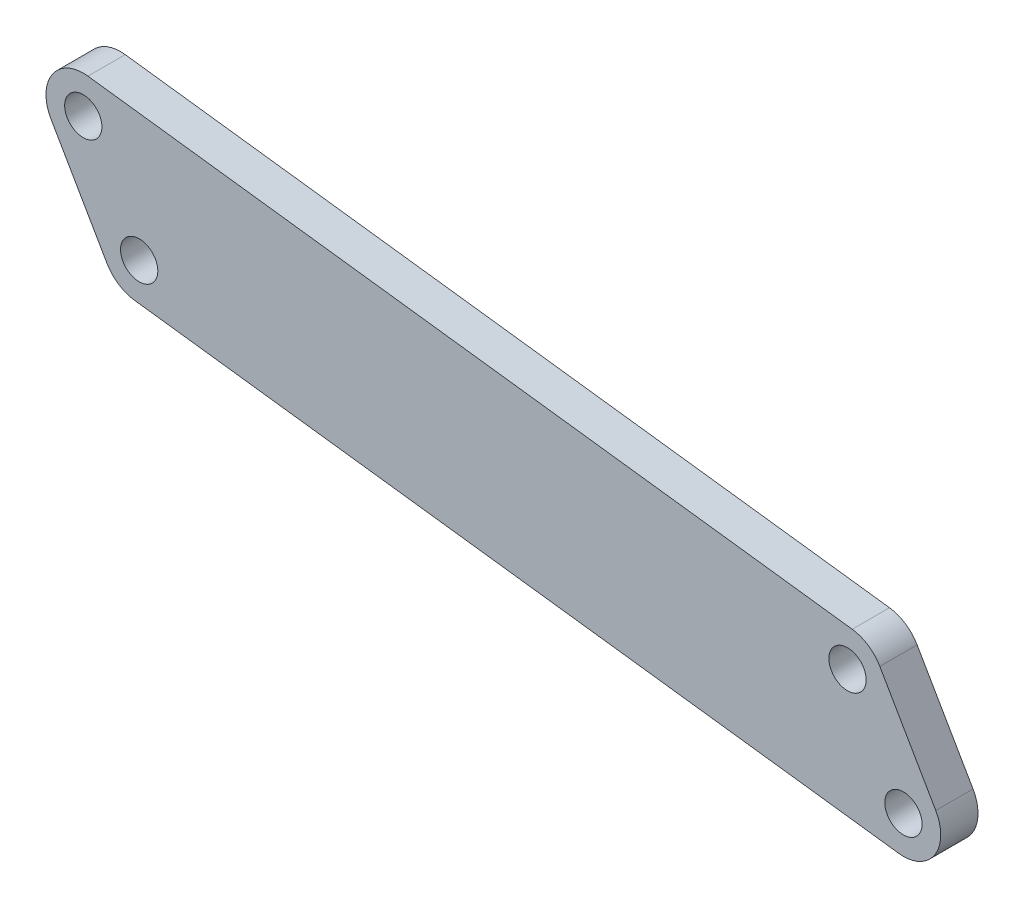
ISO-10303-21;
HEADER;
FILE_DESCRIPTION(('STEP AP214'),'2;1');
FILE_NAME('part.step','',(''),(''),'','','');
FILE_SCHEMA(('AUTOMOTIVE_DESIGN { 1 0 10303 214 1 1 1 1 }'));
ENDSEC;
DATA;
#1=APPLICATION_CONTEXT('core data for automotive mechanical design processes');
#2=APPLICATION_PROTOCOL_DEFINITION('international standard','automotive_design',2000,#1);
#3=PRODUCT_CONTEXT('',#1,'mechanical');
#4=PRODUCT('Part','Part','',(#3));
#5=PRODUCT_RELATED_PRODUCT_CATEGORY('part','',(#4));
#6=PRODUCT_DEFINITION_FORMATION('','',#4);
#7=PRODUCT_DEFINITION_CONTEXT('part definition',#1,'design');
#8=PRODUCT_DEFINITION('design','',#6,#7);
#9=PRODUCT_DEFINITION_SHAPE('','',#8);
#10=(LENGTH_UNIT() NAMED_UNIT(*) SI_UNIT(.MILLI.,.METRE.));
#11=(NAMED_UNIT(*) PLANE_ANGLE_UNIT() SI_UNIT($,.RADIAN.));
#12=(NAMED_UNIT(*) SI_UNIT($,.STERADIAN.) SOLID_ANGLE_UNIT());
#13=UNCERTAINTY_MEASURE_WITH_UNIT(LENGTH_MEASURE(1.E-05),#10,'distance_accuracy_value','');
#14=(GEOMETRIC_REPRESENTATION_CONTEXT(3) GLOBAL_UNCERTAINTY_ASSIGNED_CONTEXT((#13)) GLOBAL_UNIT_ASSIGNED_CONTEXT((#10,
#11,#12)) REPRESENTATION_CONTEXT('',''));
#15=CARTESIAN_POINT('',(0.,0.,0.));
#16=DIRECTION('',(0.,0.,1.));
#17=DIRECTION('',(1.,0.,0.));
#18=AXIS2_PLACEMENT_3D('',#15,#16,#17);
#19=CARTESIAN_POINT('',(-57.,0.,3.));
#20=DIRECTION('',(0.,0.,1.));
#21=DIRECTION('',(1.,0.,0.));
#22=AXIS2_PLACEMENT_3D('',#19,#20,#21);
#23=PLANE('',#22);
#24=CARTESIAN_POINT('',(0.,0.,3.));
#25=DIRECTION('',(0.,0.,1.));
#26=DIRECTION('',(1.,0.,0.));
#27=AXIS2_PLACEMENT_3D('',#24,#25,#26);
#28=CIRCLE('',#27,1.5);
#29=CARTESIAN_POINT('',(1.5,0.,3.));
#30=VERTEX_POINT('',#29);
#31=EDGE_CURVE('E221',#30,#30,#28,.T.);
#32=ORIENTED_EDGE('',*,*,#31,.F.);
#33=EDGE_LOOP('',(#32));
#34=FACE_BOUND('',#33,.T.);
#35=CARTESIAN_POINT('',(-57.,0.,3.));
#36=DIRECTION('',(0.,0.,1.));
#37=DIRECTION('',(1.,0.,0.));
#38=AXIS2_PLACEMENT_3D('',#35,#36,#37);
#39=CIRCLE('',#38,1.5);
#40=CARTESIAN_POINT('',(-55.5,0.,3.));
#41=VERTEX_POINT('',#40);
#42=EDGE_CURVE('E146',#41,#41,#39,.T.);
#43=ORIENTED_EDGE('',*,*,#42,.F.);
#44=EDGE_LOOP('',(#43));
#45=FACE_BOUND('',#44,.T.);
#46=CARTESIAN_POINT('',(-57.,0.,3.));
#47=DIRECTION('',(0.,0.,1.));
#48=DIRECTION('',(1.,0.,0.));
#49=AXIS2_PLACEMENT_3D('',#46,#47,#48);
#50=CIRCLE('',#49,3.);
#51=CARTESIAN_POINT('',(-59.5980762113533,-1.5,3.));
#52=VERTEX_POINT('',#51);
#53=CARTESIAN_POINT('',(-57.3771891604533,-2.97619359874935,3.));
#54=VERTEX_POINT('',#53);
#55=EDGE_CURVE('E164',#52,#54,#50,.T.);
#56=ORIENTED_EDGE('',*,*,#55,.T.);
#57=DIRECTION('',(0.992064532916446,-0.1257297201511,0.));
#58=VECTOR('',#57,1.);
#59=CARTESIAN_POINT('',(4.12281083954674,-10.7704222328093,3.));
#60=LINE('',#59,#58);
#61=CARTESIAN_POINT('',(4.12281083954674,-10.7704222328093,3.));
#62=VERTEX_POINT('',#61);
#63=EDGE_CURVE('E100',#54,#62,#60,.T.);
#64=ORIENTED_EDGE('',*,*,#63,.T.);
#65=CARTESIAN_POINT('',(4.50000000000004,-7.79422863405993,3.));
#66=DIRECTION('',(0.,0.,1.));
#67=DIRECTION('',(1.,0.,0.));
#68=AXIS2_PLACEMENT_3D('',#65,#66,#67);
#69=CIRCLE('',#68,3.);
#70=CARTESIAN_POINT('',(7.09807621135335,-6.29422863405991,3.));
#71=VERTEX_POINT('',#70);
#72=EDGE_CURVE('E185',#62,#71,#69,.T.);
#73=ORIENTED_EDGE('',*,*,#72,.T.);
#74=DIRECTION('',(-0.500000000000004,0.866025403784436,0.));
#75=VECTOR('',#74,1.);
#76=CARTESIAN_POINT('',(2.59807621135331,1.50000000000001,3.));
#77=LINE('',#76,#75);
#78=CARTESIAN_POINT('',(2.59807621135331,1.50000000000001,3.));
#79=VERTEX_POINT('',#78);
#80=EDGE_CURVE('E199',#71,#79,#77,.T.);
#81=ORIENTED_EDGE('',*,*,#80,.T.);
#82=CARTESIAN_POINT('',(0.,0.,3.));
#83=DIRECTION('',(0.,0.,1.));
#84=DIRECTION('',(1.,0.,0.));
#85=AXIS2_PLACEMENT_3D('',#82,#83,#84);
#86=CIRCLE('',#85,3.);
#87=CARTESIAN_POINT('',(0.377189160453301,2.97619359874934,3.));
#88=VERTEX_POINT('',#87);
#89=EDGE_CURVE('E119',#79,#88,#86,.T.);
#90=ORIENTED_EDGE('',*,*,#89,.T.);
#91=DIRECTION('',(-0.992064532916446,0.1257297201511,0.));
#92=VECTOR('',#91,1.);
#93=CARTESIAN_POINT('',(-61.1228108395467,10.7704222328093,3.));
#94=LINE('',#93,#92);
#95=CARTESIAN_POINT('',(-61.1228108395467,10.7704222328093,3.));
#96=VERTEX_POINT('',#95);
#97=EDGE_CURVE('E113',#88,#96,#94,.T.);
#98=ORIENTED_EDGE('',*,*,#97,.T.);
#99=CARTESIAN_POINT('',(-61.5,7.79422863405996,3.));
#100=DIRECTION('',(0.,0.,1.));
#101=DIRECTION('',(1.,0.,0.));
#102=AXIS2_PLACEMENT_3D('',#99,#100,#101);
#103=CIRCLE('',#102,3.);
#104=CARTESIAN_POINT('',(-64.0980762113533,6.29422863405996,3.));
#105=VERTEX_POINT('',#104);
#106=EDGE_CURVE('E117',#96,#105,#103,.T.);
#107=ORIENTED_EDGE('',*,*,#106,.T.);
#108=DIRECTION('',(0.499999999999998,-0.86602540378444,0.));
#109=VECTOR('',#108,1.);
#110=CARTESIAN_POINT('',(-59.5980762113533,-1.5,3.));
#111=LINE('',#110,#109);
#112=EDGE_CURVE('E57',#105,#52,#111,.T.);
#113=ORIENTED_EDGE('',*,*,#112,.T.);
#114=EDGE_LOOP('',(#56,#64,#73,#81,#90,#98,#107,#113));
#115=FACE_BOUND('',#114,.T.);
#116=CARTESIAN_POINT('',(-61.5,7.79422863405996,3.));
#117=DIRECTION('',(0.,0.,1.));
#118=DIRECTION('',(1.,0.,0.));
#119=AXIS2_PLACEMENT_3D('',#116,#117,#118);
#120=CIRCLE('',#119,1.5);
#121=CARTESIAN_POINT('',(-60.,7.79422863405996,3.));
#122=VERTEX_POINT('',#121);
#123=EDGE_CURVE('E213',#122,#122,#120,.T.);
#124=ORIENTED_EDGE('',*,*,#123,.F.);
#125=EDGE_LOOP('',(#124));
#126=FACE_BOUND('',#125,.T.);
#127=CARTESIAN_POINT('',(4.50000000000004,-7.79422863405993,3.));
#128=DIRECTION('',(0.,0.,1.));
#129=DIRECTION('',(1.,0.,0.));
#130=AXIS2_PLACEMENT_3D('',#127,#128,#129);
#131=CIRCLE('',#130,1.5);
#132=CARTESIAN_POINT('',(6.00000000000004,-7.79422863405993,3.));
#133=VERTEX_POINT('',#132);
#134=EDGE_CURVE('E229',#133,#133,#131,.T.);
#135=ORIENTED_EDGE('',*,*,#134,.F.);
#136=EDGE_LOOP('',(#135));
#137=FACE_BOUND('',#136,.T.);
#138=ADVANCED_FACE('F39',(#34,#45,#115,#126,#137),#23,.T.);
#139=CARTESIAN_POINT('',(-57.,0.,0.));
#140=DIRECTION('',(0.,0.,1.));
#141=DIRECTION('',(1.,0.,0.));
#142=AXIS2_PLACEMENT_3D('',#139,#140,#141);
#143=PLANE('',#142);
#144=CARTESIAN_POINT('',(-57.,0.,0.));
#145=DIRECTION('',(0.,0.,1.));
#146=DIRECTION('',(1.,0.,0.));
#147=AXIS2_PLACEMENT_3D('',#144,#145,#146);
#148=CIRCLE('',#147,3.);
#149=CARTESIAN_POINT('',(-59.5980762113533,-1.5,0.));
#150=VERTEX_POINT('',#149);
#151=CARTESIAN_POINT('',(-57.3771891604533,-2.97619359874935,0.));
#152=VERTEX_POINT('',#151);
#153=EDGE_CURVE('E141',#150,#152,#148,.T.);
#154=ORIENTED_EDGE('',*,*,#153,.F.);
#155=DIRECTION('',(0.499999999999998,-0.86602540378444,0.));
#156=VECTOR('',#155,1.);
#157=CARTESIAN_POINT('',(-59.5980762113533,-1.5,0.));
#158=LINE('',#157,#156);
#159=CARTESIAN_POINT('',(-64.0980762113533,6.29422863405996,0.));
#160=VERTEX_POINT('',#159);
#161=EDGE_CURVE('E92',#160,#150,#158,.T.);
#162=ORIENTED_EDGE('',*,*,#161,.F.);
#163=CARTESIAN_POINT('',(-61.5,7.79422863405996,0.));
#164=DIRECTION('',(0.,0.,1.));
#165=DIRECTION('',(1.,0.,0.));
#166=AXIS2_PLACEMENT_3D('',#163,#164,#165);
#167=CIRCLE('',#166,3.);
#168=CARTESIAN_POINT('',(-61.1228108395467,10.7704222328093,0.));
#169=VERTEX_POINT('',#168);
#170=EDGE_CURVE('E86',#169,#160,#167,.T.);
#171=ORIENTED_EDGE('',*,*,#170,.F.);
#172=DIRECTION('',(-0.992064532916446,0.1257297201511,0.));
#173=VECTOR('',#172,1.);
#174=CARTESIAN_POINT('',(-61.1228108395467,10.7704222328093,0.));
#175=LINE('',#174,#173);
#176=CARTESIAN_POINT('',(0.377189160453301,2.97619359874934,0.));
#177=VERTEX_POINT('',#176);
#178=EDGE_CURVE('E128',#177,#169,#175,.T.);
#179=ORIENTED_EDGE('',*,*,#178,.F.);
#180=CARTESIAN_POINT('',(0.,0.,0.));
#181=DIRECTION('',(0.,0.,1.));
#182=DIRECTION('',(1.,0.,0.));
#183=AXIS2_PLACEMENT_3D('',#180,#181,#182);
#184=CIRCLE('',#183,3.);
#185=CARTESIAN_POINT('',(2.59807621135331,1.50000000000001,0.));
#186=VERTEX_POINT('',#185);
#187=EDGE_CURVE('E155',#186,#177,#184,.T.);
#188=ORIENTED_EDGE('',*,*,#187,.F.);
#189=DIRECTION('',(-0.500000000000004,0.866025403784436,0.));
#190=VECTOR('',#189,1.);
#191=CARTESIAN_POINT('',(2.59807621135331,1.50000000000001,0.));
#192=LINE('',#191,#190);
#193=CARTESIAN_POINT('',(7.09807621135335,-6.29422863405991,0.));
#194=VERTEX_POINT('',#193);
#195=EDGE_CURVE('E152',#194,#186,#192,.T.);
#196=ORIENTED_EDGE('',*,*,#195,.F.);
#197=CARTESIAN_POINT('',(4.50000000000004,-7.79422863405993,0.));
#198=DIRECTION('',(0.,0.,1.));
#199=DIRECTION('',(1.,0.,0.));
#200=AXIS2_PLACEMENT_3D('',#197,#198,#199);
#201=CIRCLE('',#200,3.);
#202=CARTESIAN_POINT('',(4.12281083954674,-10.7704222328093,0.));
#203=VERTEX_POINT('',#202);
#204=EDGE_CURVE('E149',#203,#194,#201,.T.);
#205=ORIENTED_EDGE('',*,*,#204,.F.);
#206=DIRECTION('',(0.992064532916446,-0.1257297201511,0.));
#207=VECTOR('',#206,1.);
#208=CARTESIAN_POINT('',(4.12281083954674,-10.7704222328093,0.));
#209=LINE('',#208,#207);
#210=EDGE_CURVE('E145',#152,#203,#209,.T.);
#211=ORIENTED_EDGE('',*,*,#210,.F.);
#212=EDGE_LOOP('',(#154,#162,#171,#179,#188,#196,#205,#211));
#213=FACE_BOUND('',#212,.T.);
#214=CARTESIAN_POINT('',(-57.,0.,0.));
#215=DIRECTION('',(0.,0.,1.));
#216=DIRECTION('',(1.,0.,0.));
#217=AXIS2_PLACEMENT_3D('',#214,#215,#216);
#218=CIRCLE('',#217,1.5);
#219=CARTESIAN_POINT('',(-55.5,0.,0.));
#220=VERTEX_POINT('',#219);
#221=EDGE_CURVE('E209',#220,#220,#218,.T.);
#222=ORIENTED_EDGE('',*,*,#221,.T.);
#223=EDGE_LOOP('',(#222));
#224=FACE_BOUND('',#223,.T.);
#225=CARTESIAN_POINT('',(-61.5,7.79422863405996,0.));
#226=DIRECTION('',(0.,0.,1.));
#227=DIRECTION('',(1.,0.,0.));
#228=AXIS2_PLACEMENT_3D('',#225,#226,#227);
#229=CIRCLE('',#228,1.5);
#230=CARTESIAN_POINT('',(-60.,7.79422863405996,0.));
#231=VERTEX_POINT('',#230);
#232=EDGE_CURVE('E217',#231,#231,#229,.T.);
#233=ORIENTED_EDGE('',*,*,#232,.T.);
#234=EDGE_LOOP('',(#233));
#235=FACE_BOUND('',#234,.T.);
#236=CARTESIAN_POINT('',(0.,0.,0.));
#237=DIRECTION('',(0.,0.,1.));
#238=DIRECTION('',(1.,0.,0.));
#239=AXIS2_PLACEMENT_3D('',#236,#237,#238);
#240=CIRCLE('',#239,1.5);
#241=CARTESIAN_POINT('',(1.5,0.,0.));
#242=VERTEX_POINT('',#241);
#243=EDGE_CURVE('E225',#242,#242,#240,.T.);
#244=ORIENTED_EDGE('',*,*,#243,.T.);
#245=EDGE_LOOP('',(#244));
#246=FACE_BOUND('',#245,.T.);
#247=CARTESIAN_POINT('',(4.50000000000004,-7.79422863405993,0.));
#248=DIRECTION('',(0.,0.,1.));
#249=DIRECTION('',(1.,0.,0.));
#250=AXIS2_PLACEMENT_3D('',#247,#248,#249);
#251=CIRCLE('',#250,1.5);
#252=CARTESIAN_POINT('',(6.00000000000004,-7.79422863405993,0.));
#253=VERTEX_POINT('',#252);
#254=EDGE_CURVE('E233',#253,#253,#251,.T.);
#255=ORIENTED_EDGE('',*,*,#254,.T.);
#256=EDGE_LOOP('',(#255));
#257=FACE_BOUND('',#256,.T.);
#258=ADVANCED_FACE('F189',(#213,#224,#235,#246,#257),#143,.F.);
#259=CARTESIAN_POINT('',(-57.,0.,3.));
#260=DIRECTION('',(0.,0.,-1.));
#261=DIRECTION('',(-1.,0.,0.));
#262=AXIS2_PLACEMENT_3D('',#259,#260,#261);
#263=CYLINDRICAL_SURFACE('',#262,3.);
#264=ORIENTED_EDGE('',*,*,#153,.T.);
#265=DIRECTION('',(0.,0.,-1.));
#266=VECTOR('',#265,1.);
#267=CARTESIAN_POINT('',(-57.3771891604533,-2.97619359874935,3.));
#268=LINE('',#267,#266);
#269=EDGE_CURVE('E11',#54,#152,#268,.T.);
#270=ORIENTED_EDGE('',*,*,#269,.F.);
#271=ORIENTED_EDGE('',*,*,#55,.F.);
#272=DIRECTION('',(0.,0.,-1.));
#273=VECTOR('',#272,1.);
#274=CARTESIAN_POINT('',(-59.5980762113533,-1.5,3.));
#275=LINE('',#274,#273);
#276=EDGE_CURVE('E137',#52,#150,#275,.T.);
#277=ORIENTED_EDGE('',*,*,#276,.T.);
#278=EDGE_LOOP('',(#264,#270,#271,#277));
#279=FACE_BOUND('',#278,.T.);
#280=ADVANCED_FACE('F41',(#279),#263,.T.);
#281=CARTESIAN_POINT('',(4.12281083954674,-10.7704222328093,3.));
#282=DIRECTION('',(0.1257297201511,0.992064532916446,0.));
#283=DIRECTION('',(-0.992064532916446,0.1257297201511,0.));
#284=AXIS2_PLACEMENT_3D('',#281,#282,#283);
#285=PLANE('',#284);
#286=ORIENTED_EDGE('',*,*,#210,.T.);
#287=DIRECTION('',(0.,0.,-1.));
#288=VECTOR('',#287,1.);
#289=CARTESIAN_POINT('',(4.12281083954674,-10.7704222328093,3.));
#290=LINE('',#289,#288);
#291=EDGE_CURVE('E49',#62,#203,#290,.T.);
#292=ORIENTED_EDGE('',*,*,#291,.F.);
#293=ORIENTED_EDGE('',*,*,#63,.F.);
#294=ORIENTED_EDGE('',*,*,#269,.T.);
#295=EDGE_LOOP('',(#286,#292,#293,#294));
#296=FACE_BOUND('',#295,.T.);
#297=ADVANCED_FACE('F269',(#296),#285,.F.);
#298=CARTESIAN_POINT('',(4.50000000000004,-7.79422863405993,3.));
#299=DIRECTION('',(0.,0.,-1.));
#300=DIRECTION('',(-1.,0.,0.));
#301=AXIS2_PLACEMENT_3D('',#298,#299,#300);
#302=CYLINDRICAL_SURFACE('',#301,3.);
#303=ORIENTED_EDGE('',*,*,#204,.T.);
#304=DIRECTION('',(0.,0.,-1.));
#305=VECTOR('',#304,1.);
#306=CARTESIAN_POINT('',(7.09807621135335,-6.29422863405991,3.));
#307=LINE('',#306,#305);
#308=EDGE_CURVE('E175',#71,#194,#307,.T.);
#309=ORIENTED_EDGE('',*,*,#308,.F.);
#310=ORIENTED_EDGE('',*,*,#72,.F.);
#311=ORIENTED_EDGE('',*,*,#291,.T.);
#312=EDGE_LOOP('',(#303,#309,#310,#311));
#313=FACE_BOUND('',#312,.T.);
#314=ADVANCED_FACE('F183',(#313),#302,.T.);
#315=CARTESIAN_POINT('',(2.59807621135331,1.50000000000001,3.));
#316=DIRECTION('',(-0.866025403784436,-0.500000000000004,0.));
#317=DIRECTION('',(0.500000000000004,-0.866025403784436,0.));
#318=AXIS2_PLACEMENT_3D('',#315,#316,#317);
#319=PLANE('',#318);
#320=ORIENTED_EDGE('',*,*,#195,.T.);
#321=DIRECTION('',(0.,0.,-1.));
#322=VECTOR('',#321,1.);
#323=CARTESIAN_POINT('',(2.59807621135331,1.50000000000001,3.));
#324=LINE('',#323,#322);
#325=EDGE_CURVE('E171',#79,#186,#324,.T.);
#326=ORIENTED_EDGE('',*,*,#325,.F.);
#327=ORIENTED_EDGE('',*,*,#80,.F.);
#328=ORIENTED_EDGE('',*,*,#308,.T.);
#329=EDGE_LOOP('',(#320,#326,#327,#328));
#330=FACE_BOUND('',#329,.T.);
#331=ADVANCED_FACE('F194',(#330),#319,.F.);
#332=CARTESIAN_POINT('',(0.,0.,3.));
#333=DIRECTION('',(0.,0.,-1.));
#334=DIRECTION('',(-1.,0.,0.));
#335=AXIS2_PLACEMENT_3D('',#332,#333,#334);
#336=CYLINDRICAL_SURFACE('',#335,3.);
#337=ORIENTED_EDGE('',*,*,#187,.T.);
#338=DIRECTION('',(0.,0.,-1.));
#339=VECTOR('',#338,1.);
#340=CARTESIAN_POINT('',(0.377189160453301,2.97619359874934,3.));
#341=LINE('',#340,#339);
#342=EDGE_CURVE('E130',#88,#177,#341,.T.);
#343=ORIENTED_EDGE('',*,*,#342,.F.);
#344=ORIENTED_EDGE('',*,*,#89,.F.);
#345=ORIENTED_EDGE('',*,*,#325,.T.);
#346=EDGE_LOOP('',(#337,#343,#344,#345));
#347=FACE_BOUND('',#346,.T.);
#348=ADVANCED_FACE('F197',(#347),#336,.T.);
#349=CARTESIAN_POINT('',(-61.1228108395467,10.7704222328093,3.));
#350=DIRECTION('',(-0.1257297201511,-0.992064532916446,0.));
#351=DIRECTION('',(0.992064532916446,-0.125729720151101,0.));
#352=AXIS2_PLACEMENT_3D('',#349,#350,#351);
#353=PLANE('',#352);
#354=ORIENTED_EDGE('',*,*,#178,.T.);
#355=DIRECTION('',(0.,0.,-1.));
#356=VECTOR('',#355,1.);
#357=CARTESIAN_POINT('',(-61.1228108395467,10.7704222328093,3.));
#358=LINE('',#357,#356);
#359=EDGE_CURVE('E125',#96,#169,#358,.T.);
#360=ORIENTED_EDGE('',*,*,#359,.F.);
#361=ORIENTED_EDGE('',*,*,#97,.F.);
#362=ORIENTED_EDGE('',*,*,#342,.T.);
#363=EDGE_LOOP('',(#354,#360,#361,#362));
#364=FACE_BOUND('',#363,.T.);
#365=ADVANCED_FACE('F126',(#364),#353,.F.);
#366=CARTESIAN_POINT('',(-61.5,7.79422863405996,3.));
#367=DIRECTION('',(0.,0.,-1.));
#368=DIRECTION('',(-1.,0.,0.));
#369=AXIS2_PLACEMENT_3D('',#366,#367,#368);
#370=CYLINDRICAL_SURFACE('',#369,3.);
#371=ORIENTED_EDGE('',*,*,#170,.T.);
#372=DIRECTION('',(0.,0.,-1.));
#373=VECTOR('',#372,1.);
#374=CARTESIAN_POINT('',(-64.0980762113533,6.29422863405996,3.));
#375=LINE('',#374,#373);
#376=EDGE_CURVE('E131',#105,#160,#375,.T.);
#377=ORIENTED_EDGE('',*,*,#376,.F.);
#378=ORIENTED_EDGE('',*,*,#106,.F.);
#379=ORIENTED_EDGE('',*,*,#359,.T.);
#380=EDGE_LOOP('',(#371,#377,#378,#379));
#381=FACE_BOUND('',#380,.T.);
#382=ADVANCED_FACE('F133',(#381),#370,.T.);
#383=CARTESIAN_POINT('',(-59.5980762113533,-1.5,3.));
#384=DIRECTION('',(0.86602540378444,0.499999999999998,0.));
#385=DIRECTION('',(-0.499999999999998,0.86602540378444,0.));
#386=AXIS2_PLACEMENT_3D('',#383,#384,#385);
#387=PLANE('',#386);
#388=ORIENTED_EDGE('',*,*,#161,.T.);
#389=ORIENTED_EDGE('',*,*,#276,.F.);
#390=ORIENTED_EDGE('',*,*,#112,.F.);
#391=ORIENTED_EDGE('',*,*,#376,.T.);
#392=EDGE_LOOP('',(#388,#389,#390,#391));
#393=FACE_BOUND('',#392,.T.);
#394=ADVANCED_FACE('F257',(#393),#387,.F.);
#395=CARTESIAN_POINT('',(-57.,0.,3.));
#396=DIRECTION('',(0.,0.,-1.));
#397=DIRECTION('',(-1.,0.,0.));
#398=AXIS2_PLACEMENT_3D('',#395,#396,#397);
#399=CYLINDRICAL_SURFACE('',#398,1.5);
#400=ORIENTED_EDGE('',*,*,#42,.T.);
#401=EDGE_LOOP('',(#400));
#402=FACE_BOUND('',#401,.T.);
#403=ORIENTED_EDGE('',*,*,#221,.F.);
#404=EDGE_LOOP('',(#403));
#405=FACE_BOUND('',#404,.T.);
#406=ADVANCED_FACE('F254',(#402,#405),#399,.F.);
#407=CARTESIAN_POINT('',(-61.5,7.79422863405996,3.));
#408=DIRECTION('',(0.,0.,-1.));
#409=DIRECTION('',(-1.,0.,0.));
#410=AXIS2_PLACEMENT_3D('',#407,#408,#409);
#411=CYLINDRICAL_SURFACE('',#410,1.5);
#412=ORIENTED_EDGE('',*,*,#123,.T.);
#413=EDGE_LOOP('',(#412));
#414=FACE_BOUND('',#413,.T.);
#415=ORIENTED_EDGE('',*,*,#232,.F.);
#416=EDGE_LOOP('',(#415));
#417=FACE_BOUND('',#416,.T.);
#418=ADVANCED_FACE('F333',(#414,#417),#411,.F.);
#419=CARTESIAN_POINT('',(0.,0.,3.));
#420=DIRECTION('',(0.,0.,-1.));
#421=DIRECTION('',(-1.,0.,0.));
#422=AXIS2_PLACEMENT_3D('',#419,#420,#421);
#423=CYLINDRICAL_SURFACE('',#422,1.5);
#424=ORIENTED_EDGE('',*,*,#31,.T.);
#425=EDGE_LOOP('',(#424));
#426=FACE_BOUND('',#425,.T.);
#427=ORIENTED_EDGE('',*,*,#243,.F.);
#428=EDGE_LOOP('',(#427));
#429=FACE_BOUND('',#428,.T.);
#430=ADVANCED_FACE('F341',(#426,#429),#423,.F.);
#431=CARTESIAN_POINT('',(4.50000000000004,-7.79422863405993,3.));
#432=DIRECTION('',(0.,0.,-1.));
#433=DIRECTION('',(-1.,0.,0.));
#434=AXIS2_PLACEMENT_3D('',#431,#432,#433);
#435=CYLINDRICAL_SURFACE('',#434,1.5);
#436=ORIENTED_EDGE('',*,*,#134,.T.);
#437=EDGE_LOOP('',(#436));
#438=FACE_BOUND('',#437,.T.);
#439=ORIENTED_EDGE('',*,*,#254,.F.);
#440=EDGE_LOOP('',(#439));
#441=FACE_BOUND('',#440,.T.);
#442=ADVANCED_FACE('F241',(#438,#441),#435,.F.);
#443=CLOSED_SHELL('',(#138,#258,#280,#297,#314,#331,#348,#365,#382,#394,#406,#418,#430,#442));
#444=MANIFOLD_SOLID_BREP('B2',#443);
#445=ADVANCED_BREP_SHAPE_REPRESENTATION('',(#18,#444),#14);
#446=SHAPE_DEFINITION_REPRESENTATION(#9,#445);
ENDSEC;
END-ISO-10303-21;
